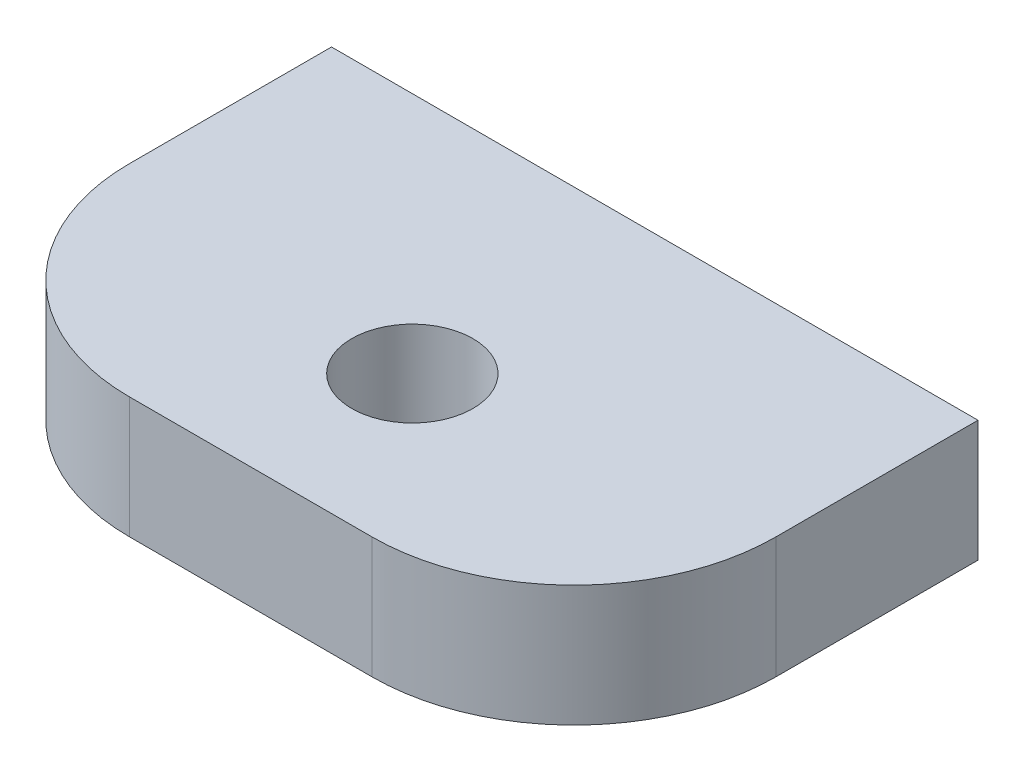
ISO-10303-21;
HEADER;
FILE_DESCRIPTION(('STEP AP214'),'2;1');
FILE_NAME('part.step','',(''),(''),'','','');
FILE_SCHEMA(('AUTOMOTIVE_DESIGN { 1 0 10303 214 1 1 1 1 }'));
ENDSEC;
DATA;
#1=APPLICATION_CONTEXT('core data for automotive mechanical design processes');
#2=APPLICATION_PROTOCOL_DEFINITION('international standard','automotive_design',2000,#1);
#3=PRODUCT_CONTEXT('',#1,'mechanical');
#4=PRODUCT('Part','Part','',(#3));
#5=PRODUCT_RELATED_PRODUCT_CATEGORY('part','',(#4));
#6=PRODUCT_DEFINITION_FORMATION('','',#4);
#7=PRODUCT_DEFINITION_CONTEXT('part definition',#1,'design');
#8=PRODUCT_DEFINITION('design','',#6,#7);
#9=PRODUCT_DEFINITION_SHAPE('','',#8);
#10=(LENGTH_UNIT() NAMED_UNIT(*) SI_UNIT(.MILLI.,.METRE.));
#11=(NAMED_UNIT(*) PLANE_ANGLE_UNIT() SI_UNIT($,.RADIAN.));
#12=(NAMED_UNIT(*) SI_UNIT($,.STERADIAN.) SOLID_ANGLE_UNIT());
#13=UNCERTAINTY_MEASURE_WITH_UNIT(LENGTH_MEASURE(1.E-05),#10,'distance_accuracy_value','');
#14=(GEOMETRIC_REPRESENTATION_CONTEXT(3) GLOBAL_UNCERTAINTY_ASSIGNED_CONTEXT((#13)) GLOBAL_UNIT_ASSIGNED_CONTEXT((#10,
#11,#12)) REPRESENTATION_CONTEXT('',''));
#15=CARTESIAN_POINT('',(0.,0.,0.));
#16=DIRECTION('',(0.,0.,1.));
#17=DIRECTION('',(1.,0.,0.));
#18=AXIS2_PLACEMENT_3D('',#15,#16,#17);
#19=CARTESIAN_POINT('',(8.,3.,-5.));
#20=DIRECTION('',(-1.,0.,0.));
#21=DIRECTION('',(0.,0.,1.));
#22=AXIS2_PLACEMENT_3D('',#19,#20,#21);
#23=PLANE('',#22);
#24=DIRECTION('',(0.,0.,-1.));
#25=VECTOR('',#24,1.);
#26=CARTESIAN_POINT('',(8.,3.,-5.));
#27=LINE('',#26,#25);
#28=CARTESIAN_POINT('',(8.,3.,0.));
#29=VERTEX_POINT('',#28);
#30=CARTESIAN_POINT('',(8.,3.,-5.));
#31=VERTEX_POINT('',#30);
#32=EDGE_CURVE('E87',#29,#31,#27,.T.);
#33=ORIENTED_EDGE('',*,*,#32,.F.);
#34=DIRECTION('',(0.,-1.,0.));
#35=VECTOR('',#34,1.);
#36=CARTESIAN_POINT('',(8.,3.,0.));
#37=LINE('',#36,#35);
#38=CARTESIAN_POINT('',(8.,0.,0.));
#39=VERTEX_POINT('',#38);
#40=EDGE_CURVE('E110',#29,#39,#37,.T.);
#41=ORIENTED_EDGE('',*,*,#40,.T.);
#42=DIRECTION('',(0.,0.,-1.));
#43=VECTOR('',#42,1.);
#44=CARTESIAN_POINT('',(8.,0.,-5.));
#45=LINE('',#44,#43);
#46=CARTESIAN_POINT('',(8.,0.,-5.));
#47=VERTEX_POINT('',#46);
#48=EDGE_CURVE('E108',#39,#47,#45,.T.);
#49=ORIENTED_EDGE('',*,*,#48,.T.);
#50=DIRECTION('',(0.,-1.,0.));
#51=VECTOR('',#50,1.);
#52=CARTESIAN_POINT('',(8.,3.,-5.));
#53=LINE('',#52,#51);
#54=EDGE_CURVE('E102',#31,#47,#53,.T.);
#55=ORIENTED_EDGE('',*,*,#54,.F.);
#56=EDGE_LOOP('',(#33,#41,#49,#55));
#57=FACE_BOUND('',#56,.T.);
#58=ADVANCED_FACE('F33',(#57),#23,.F.);
#59=CARTESIAN_POINT('',(-8.,3.,-5.));
#60=DIRECTION('',(0.,0.,1.));
#61=DIRECTION('',(1.,0.,0.));
#62=AXIS2_PLACEMENT_3D('',#59,#60,#61);
#63=PLANE('',#62);
#64=DIRECTION('',(-1.,0.,0.));
#65=VECTOR('',#64,1.);
#66=CARTESIAN_POINT('',(-8.,0.,-5.));
#67=LINE('',#66,#65);
#68=CARTESIAN_POINT('',(-8.,0.,-5.));
#69=VERTEX_POINT('',#68);
#70=EDGE_CURVE('E137',#47,#69,#67,.T.);
#71=ORIENTED_EDGE('',*,*,#70,.T.);
#72=DIRECTION('',(0.,-1.,0.));
#73=VECTOR('',#72,1.);
#74=CARTESIAN_POINT('',(-8.,3.,-5.));
#75=LINE('',#74,#73);
#76=CARTESIAN_POINT('',(-8.,3.,-5.));
#77=VERTEX_POINT('',#76);
#78=EDGE_CURVE('E104',#77,#69,#75,.T.);
#79=ORIENTED_EDGE('',*,*,#78,.F.);
#80=DIRECTION('',(-1.,0.,0.));
#81=VECTOR('',#80,1.);
#82=CARTESIAN_POINT('',(-8.,3.,-5.));
#83=LINE('',#82,#81);
#84=EDGE_CURVE('E90',#31,#77,#83,.T.);
#85=ORIENTED_EDGE('',*,*,#84,.F.);
#86=ORIENTED_EDGE('',*,*,#54,.T.);
#87=EDGE_LOOP('',(#71,#79,#85,#86));
#88=FACE_BOUND('',#87,.T.);
#89=ADVANCED_FACE('F101',(#88),#63,.F.);
#90=CARTESIAN_POINT('',(-8.,3.,-5.));
#91=DIRECTION('',(1.,0.,0.));
#92=DIRECTION('',(0.,0.,-1.));
#93=AXIS2_PLACEMENT_3D('',#90,#91,#92);
#94=PLANE('',#93);
#95=DIRECTION('',(0.,0.,1.));
#96=VECTOR('',#95,1.);
#97=CARTESIAN_POINT('',(-8.,0.,-5.));
#98=LINE('',#97,#96);
#99=CARTESIAN_POINT('',(-8.,0.,0.));
#100=VERTEX_POINT('',#99);
#101=EDGE_CURVE('E135',#69,#100,#98,.T.);
#102=ORIENTED_EDGE('',*,*,#101,.T.);
#103=DIRECTION('',(0.,-1.,0.));
#104=VECTOR('',#103,1.);
#105=CARTESIAN_POINT('',(-8.,3.,0.));
#106=LINE('',#105,#104);
#107=CARTESIAN_POINT('',(-8.,3.,0.));
#108=VERTEX_POINT('',#107);
#109=EDGE_CURVE('E11',#100,#108,#106,.F.);
#110=ORIENTED_EDGE('',*,*,#109,.T.);
#111=DIRECTION('',(0.,0.,1.));
#112=VECTOR('',#111,1.);
#113=CARTESIAN_POINT('',(-8.,3.,-5.));
#114=LINE('',#113,#112);
#115=EDGE_CURVE('E105',#77,#108,#114,.T.);
#116=ORIENTED_EDGE('',*,*,#115,.F.);
#117=ORIENTED_EDGE('',*,*,#78,.T.);
#118=EDGE_LOOP('',(#102,#110,#116,#117));
#119=FACE_BOUND('',#118,.T.);
#120=ADVANCED_FACE('F136',(#119),#94,.F.);
#121=CARTESIAN_POINT('',(-8.,3.,5.));
#122=DIRECTION('',(0.,0.,-1.));
#123=DIRECTION('',(-1.,0.,0.));
#124=AXIS2_PLACEMENT_3D('',#121,#122,#123);
#125=PLANE('',#124);
#126=DIRECTION('',(1.,0.,0.));
#127=VECTOR('',#126,1.);
#128=CARTESIAN_POINT('',(-8.,0.,5.));
#129=LINE('',#128,#127);
#130=CARTESIAN_POINT('',(-3.,0.,5.));
#131=VERTEX_POINT('',#130);
#132=CARTESIAN_POINT('',(3.,0.,5.));
#133=VERTEX_POINT('',#132);
#134=EDGE_CURVE('E97',#131,#133,#129,.T.);
#135=ORIENTED_EDGE('',*,*,#134,.T.);
#136=DIRECTION('',(0.,-1.,0.));
#137=VECTOR('',#136,1.);
#138=CARTESIAN_POINT('',(3.,3.,5.));
#139=LINE('',#138,#137);
#140=CARTESIAN_POINT('',(3.,3.,5.));
#141=VERTEX_POINT('',#140);
#142=EDGE_CURVE('E54',#133,#141,#139,.F.);
#143=ORIENTED_EDGE('',*,*,#142,.T.);
#144=DIRECTION('',(1.,0.,0.));
#145=VECTOR('',#144,1.);
#146=CARTESIAN_POINT('',(-8.,3.,5.));
#147=LINE('',#146,#145);
#148=CARTESIAN_POINT('',(-3.,3.,5.));
#149=VERTEX_POINT('',#148);
#150=EDGE_CURVE('E114',#149,#141,#147,.T.);
#151=ORIENTED_EDGE('',*,*,#150,.F.);
#152=DIRECTION('',(0.,-1.,0.));
#153=VECTOR('',#152,1.);
#154=CARTESIAN_POINT('',(-3.,3.,5.));
#155=LINE('',#154,#153);
#156=EDGE_CURVE('E121',#149,#131,#155,.T.);
#157=ORIENTED_EDGE('',*,*,#156,.T.);
#158=EDGE_LOOP('',(#135,#143,#151,#157));
#159=FACE_BOUND('',#158,.T.);
#160=ADVANCED_FACE('F129',(#159),#125,.F.);
#161=CARTESIAN_POINT('',(0.,3.,0.));
#162=DIRECTION('',(0.,1.,0.));
#163=DIRECTION('',(0.,0.,1.));
#164=AXIS2_PLACEMENT_3D('',#161,#162,#163);
#165=PLANE('',#164);
#166=CARTESIAN_POINT('',(0.,3.,1.));
#167=DIRECTION('',(0.,1.,0.));
#168=DIRECTION('',(0.,0.,1.));
#169=AXIS2_PLACEMENT_3D('',#166,#167,#168);
#170=CIRCLE('',#169,1.5);
#171=CARTESIAN_POINT('',(0.,3.,-0.5));
#172=VERTEX_POINT('',#171);
#173=EDGE_CURVE('E141',#172,#172,#170,.T.);
#174=ORIENTED_EDGE('',*,*,#173,.F.);
#175=EDGE_LOOP('',(#174));
#176=FACE_BOUND('',#175,.T.);
#177=ORIENTED_EDGE('',*,*,#150,.T.);
#178=CARTESIAN_POINT('',(3.,3.,0.));
#179=DIRECTION('',(0.,1.,0.));
#180=DIRECTION('',(0.,0.,1.));
#181=AXIS2_PLACEMENT_3D('',#178,#179,#180);
#182=CIRCLE('',#181,5.);
#183=EDGE_CURVE('E41',#141,#29,#182,.T.);
#184=ORIENTED_EDGE('',*,*,#183,.T.);
#185=ORIENTED_EDGE('',*,*,#32,.T.);
#186=ORIENTED_EDGE('',*,*,#84,.T.);
#187=ORIENTED_EDGE('',*,*,#115,.T.);
#188=CARTESIAN_POINT('',(-3.,3.,0.));
#189=DIRECTION('',(0.,1.,0.));
#190=DIRECTION('',(0.,0.,1.));
#191=AXIS2_PLACEMENT_3D('',#188,#189,#190);
#192=CIRCLE('',#191,5.);
#193=EDGE_CURVE('E125',#108,#149,#192,.T.);
#194=ORIENTED_EDGE('',*,*,#193,.T.);
#195=EDGE_LOOP('',(#177,#184,#185,#186,#187,#194));
#196=FACE_BOUND('',#195,.T.);
#197=ADVANCED_FACE('F89',(#176,#196),#165,.T.);
#198=CARTESIAN_POINT('',(0.,0.,0.));
#199=DIRECTION('',(0.,1.,0.));
#200=DIRECTION('',(0.,0.,1.));
#201=AXIS2_PLACEMENT_3D('',#198,#199,#200);
#202=PLANE('',#201);
#203=CARTESIAN_POINT('',(0.,0.,1.));
#204=DIRECTION('',(0.,1.,0.));
#205=DIRECTION('',(0.,0.,1.));
#206=AXIS2_PLACEMENT_3D('',#203,#204,#205);
#207=CIRCLE('',#206,1.5);
#208=CARTESIAN_POINT('',(0.,0.,-0.5));
#209=VERTEX_POINT('',#208);
#210=EDGE_CURVE('E146',#209,#209,#207,.T.);
#211=ORIENTED_EDGE('',*,*,#210,.T.);
#212=EDGE_LOOP('',(#211));
#213=FACE_BOUND('',#212,.T.);
#214=ORIENTED_EDGE('',*,*,#48,.F.);
#215=CARTESIAN_POINT('',(3.,0.,0.));
#216=DIRECTION('',(0.,1.,0.));
#217=DIRECTION('',(0.,0.,1.));
#218=AXIS2_PLACEMENT_3D('',#215,#216,#217);
#219=CIRCLE('',#218,5.);
#220=EDGE_CURVE('E119',#39,#133,#219,.F.);
#221=ORIENTED_EDGE('',*,*,#220,.T.);
#222=ORIENTED_EDGE('',*,*,#134,.F.);
#223=CARTESIAN_POINT('',(-3.,0.,0.));
#224=DIRECTION('',(0.,1.,0.));
#225=DIRECTION('',(0.,0.,1.));
#226=AXIS2_PLACEMENT_3D('',#223,#224,#225);
#227=CIRCLE('',#226,5.);
#228=EDGE_CURVE('E112',#131,#100,#227,.F.);
#229=ORIENTED_EDGE('',*,*,#228,.T.);
#230=ORIENTED_EDGE('',*,*,#101,.F.);
#231=ORIENTED_EDGE('',*,*,#70,.F.);
#232=EDGE_LOOP('',(#214,#221,#222,#229,#230,#231));
#233=FACE_BOUND('',#232,.T.);
#234=ADVANCED_FACE('F134',(#213,#233),#202,.F.);
#235=CARTESIAN_POINT('',(0.,3.001,1.));
#236=DIRECTION('',(0.,-1.,0.));
#237=DIRECTION('',(0.,0.,-1.));
#238=AXIS2_PLACEMENT_3D('',#235,#236,#237);
#239=CYLINDRICAL_SURFACE('',#238,1.5);
#240=CARTESIAN_POINT('',(0.,3.,-0.5));
#241=CARTESIAN_POINT('',(0.,2.96875,-0.5));
#242=CARTESIAN_POINT('',(0.,2.9375,-0.5));
#243=CARTESIAN_POINT('',(0.,2.875,-0.5));
#244=CARTESIAN_POINT('',(0.,2.84375,-0.5));
#245=CARTESIAN_POINT('',(0.,2.78125,-0.5));
#246=CARTESIAN_POINT('',(0.,2.75,-0.5));
#247=CARTESIAN_POINT('',(0.,2.6875,-0.5));
#248=CARTESIAN_POINT('',(0.,2.65625,-0.5));
#249=CARTESIAN_POINT('',(0.,2.59375,-0.5));
#250=CARTESIAN_POINT('',(0.,2.5625,-0.5));
#251=CARTESIAN_POINT('',(0.,2.5,-0.5));
#252=CARTESIAN_POINT('',(0.,2.46875,-0.5));
#253=CARTESIAN_POINT('',(0.,2.40625,-0.5));
#254=CARTESIAN_POINT('',(0.,2.375,-0.5));
#255=CARTESIAN_POINT('',(0.,2.3125,-0.5));
#256=CARTESIAN_POINT('',(0.,2.28125,-0.5));
#257=CARTESIAN_POINT('',(0.,2.21875,-0.5));
#258=CARTESIAN_POINT('',(0.,2.1875,-0.5));
#259=CARTESIAN_POINT('',(0.,2.125,-0.5));
#260=CARTESIAN_POINT('',(0.,2.09375,-0.5));
#261=CARTESIAN_POINT('',(0.,2.03125,-0.5));
#262=CARTESIAN_POINT('',(0.,2.,-0.5));
#263=CARTESIAN_POINT('',(0.,1.9375,-0.5));
#264=CARTESIAN_POINT('',(0.,1.90625,-0.5));
#265=CARTESIAN_POINT('',(0.,1.84375,-0.5));
#266=CARTESIAN_POINT('',(0.,1.8125,-0.5));
#267=CARTESIAN_POINT('',(0.,1.75,-0.5));
#268=CARTESIAN_POINT('',(0.,1.71875,-0.5));
#269=CARTESIAN_POINT('',(0.,1.65625,-0.5));
#270=CARTESIAN_POINT('',(0.,1.625,-0.5));
#271=CARTESIAN_POINT('',(0.,1.5625,-0.5));
#272=CARTESIAN_POINT('',(0.,1.53125,-0.5));
#273=CARTESIAN_POINT('',(0.,1.46875,-0.5));
#274=CARTESIAN_POINT('',(0.,1.4375,-0.5));
#275=CARTESIAN_POINT('',(0.,1.375,-0.5));
#276=CARTESIAN_POINT('',(0.,1.34375,-0.5));
#277=CARTESIAN_POINT('',(0.,1.28125,-0.5));
#278=CARTESIAN_POINT('',(0.,1.25,-0.5));
#279=CARTESIAN_POINT('',(0.,1.1875,-0.5));
#280=CARTESIAN_POINT('',(0.,1.15625,-0.5));
#281=CARTESIAN_POINT('',(0.,1.09375,-0.5));
#282=CARTESIAN_POINT('',(0.,1.0625,-0.5));
#283=CARTESIAN_POINT('',(0.,1.,-0.5));
#284=CARTESIAN_POINT('',(0.,0.96875,-0.5));
#285=CARTESIAN_POINT('',(0.,0.90625,-0.5));
#286=CARTESIAN_POINT('',(0.,0.875,-0.5));
#287=CARTESIAN_POINT('',(0.,0.8125,-0.5));
#288=CARTESIAN_POINT('',(0.,0.78125,-0.5));
#289=CARTESIAN_POINT('',(0.,0.71875,-0.5));
#290=CARTESIAN_POINT('',(0.,0.6875,-0.5));
#291=CARTESIAN_POINT('',(0.,0.625,-0.5));
#292=CARTESIAN_POINT('',(0.,0.59375,-0.5));
#293=CARTESIAN_POINT('',(0.,0.53125,-0.5));
#294=CARTESIAN_POINT('',(0.,0.5,-0.5));
#295=CARTESIAN_POINT('',(0.,0.4375,-0.5));
#296=CARTESIAN_POINT('',(0.,0.40625,-0.5));
#297=CARTESIAN_POINT('',(0.,0.34375,-0.5));
#298=CARTESIAN_POINT('',(0.,0.3125,-0.5));
#299=CARTESIAN_POINT('',(0.,0.25,-0.5));
#300=CARTESIAN_POINT('',(0.,0.21875,-0.5));
#301=CARTESIAN_POINT('',(0.,0.15625,-0.5));
#302=CARTESIAN_POINT('',(0.,0.125,-0.5));
#303=CARTESIAN_POINT('',(0.,0.0624999999999996,-0.5));
#304=CARTESIAN_POINT('',(0.,0.0312499999999996,-0.5));
#305=CARTESIAN_POINT('',(0.,0.,-0.5));
#306=B_SPLINE_CURVE_WITH_KNOTS('',3,(#240,#241,#242,#243,#244,#245,#246,#247,#248,#249,#250,
#251,#252,#253,#254,#255,#256,#257,#258,#259,#260,#261,#262,#263,#264,#265,#266,#267,#268,#269,
#270,#271,#272,#273,#274,#275,#276,#277,#278,#279,#280,#281,#282,#283,#284,#285,#286,#287,#288,
#289,#290,#291,#292,#293,#294,#295,#296,#297,#298,#299,#300,#301,#302,#303,#304,#305),
.UNSPECIFIED.,.F.,.F.,(4,2,2,2,2,2,2,2,2,2,2,2,2,2,2,2,2,2,2,2,2,2,2,2,2,2,2,2,2,2,2,2,4),(0.,
0.0937499999999997,0.1875,0.28125,0.375,0.46875,0.5625,0.65625,0.75,0.84375,0.9375,1.03125,
1.125,1.21875,1.3125,1.40625,1.5,1.59375,1.6875,1.78125,1.875,1.96875,2.0625,2.15625,2.25,
2.34375,2.4375,2.53125,2.625,2.71875,2.8125,2.90625,3.),.UNSPECIFIED.);
#307=EDGE_CURVE('BSEAM151',#172,#209,#306,.T.);
#308=ORIENTED_EDGE('',*,*,#173,.T.);
#309=ORIENTED_EDGE('',*,*,#210,.F.);
#310=ORIENTED_EDGE('',*,*,#307,.T.);
#311=ORIENTED_EDGE('',*,*,#307,.F.);
#312=EDGE_LOOP('',(#308,#310,#309,#311));
#313=FACE_BOUND('',#312,.T.);
#314=ADVANCED_FACE('F151',(#313),#239,.F.);
#315=CARTESIAN_POINT('',(3.,3.,0.));
#316=DIRECTION('',(0.,-1.,0.));
#317=DIRECTION('',(0.,0.,-1.));
#318=AXIS2_PLACEMENT_3D('',#315,#316,#317);
#319=CYLINDRICAL_SURFACE('',#318,5.);
#320=ORIENTED_EDGE('',*,*,#183,.F.);
#321=ORIENTED_EDGE('',*,*,#142,.F.);
#322=ORIENTED_EDGE('',*,*,#220,.F.);
#323=ORIENTED_EDGE('',*,*,#40,.F.);
#324=EDGE_LOOP('',(#320,#321,#322,#323));
#325=FACE_BOUND('',#324,.T.);
#326=ADVANCED_FACE('F153',(#325),#319,.T.);
#327=CARTESIAN_POINT('',(-3.,3.,0.));
#328=DIRECTION('',(0.,-1.,0.));
#329=DIRECTION('',(0.,0.,-1.));
#330=AXIS2_PLACEMENT_3D('',#327,#328,#329);
#331=CYLINDRICAL_SURFACE('',#330,5.);
#332=ORIENTED_EDGE('',*,*,#193,.F.);
#333=ORIENTED_EDGE('',*,*,#109,.F.);
#334=ORIENTED_EDGE('',*,*,#228,.F.);
#335=ORIENTED_EDGE('',*,*,#156,.F.);
#336=EDGE_LOOP('',(#332,#333,#334,#335));
#337=FACE_BOUND('',#336,.T.);
#338=ADVANCED_FACE('F35',(#337),#331,.T.);
#339=CLOSED_SHELL('',(#58,#89,#120,#160,#197,#234,#314,#326,#338));
#340=MANIFOLD_SOLID_BREP('B2',#339);
#341=ADVANCED_BREP_SHAPE_REPRESENTATION('',(#18,#340),#14);
#342=SHAPE_DEFINITION_REPRESENTATION(#9,#341);
ENDSEC;
END-ISO-10303-21;
